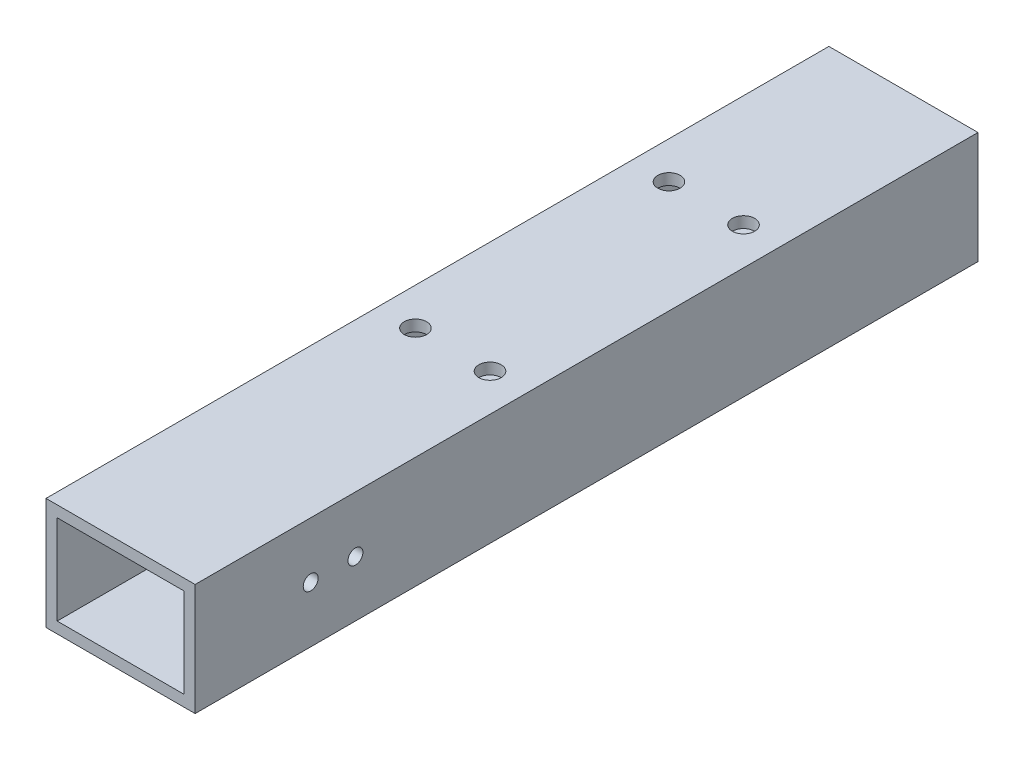
ISO-10303-21;
HEADER;
FILE_DESCRIPTION(('STEP AP214'),'2;1');
FILE_NAME('part.step','',(''),(''),'','','');
FILE_SCHEMA(('AUTOMOTIVE_DESIGN { 1 0 10303 214 1 1 1 1 }'));
ENDSEC;
DATA;
#1=APPLICATION_CONTEXT('core data for automotive mechanical design processes');
#2=APPLICATION_PROTOCOL_DEFINITION('international standard','automotive_design',2000,#1);
#3=PRODUCT_CONTEXT('',#1,'mechanical');
#4=PRODUCT('Part','Part','',(#3));
#5=PRODUCT_RELATED_PRODUCT_CATEGORY('part','',(#4));
#6=PRODUCT_DEFINITION_FORMATION('','',#4);
#7=PRODUCT_DEFINITION_CONTEXT('part definition',#1,'design');
#8=PRODUCT_DEFINITION('design','',#6,#7);
#9=PRODUCT_DEFINITION_SHAPE('','',#8);
#10=(LENGTH_UNIT() NAMED_UNIT(*) SI_UNIT(.MILLI.,.METRE.));
#11=(NAMED_UNIT(*) PLANE_ANGLE_UNIT() SI_UNIT($,.RADIAN.));
#12=(NAMED_UNIT(*) SI_UNIT($,.STERADIAN.) SOLID_ANGLE_UNIT());
#13=UNCERTAINTY_MEASURE_WITH_UNIT(LENGTH_MEASURE(1.E-05),#10,'distance_accuracy_value','');
#14=(GEOMETRIC_REPRESENTATION_CONTEXT(3) GLOBAL_UNCERTAINTY_ASSIGNED_CONTEXT((#13)) GLOBAL_UNIT_ASSIGNED_CONTEXT((#10,
#11,#12)) REPRESENTATION_CONTEXT('',''));
#15=CARTESIAN_POINT('',(0.,0.,0.));
#16=DIRECTION('',(0.,0.,1.));
#17=DIRECTION('',(1.,0.,0.));
#18=AXIS2_PLACEMENT_3D('',#15,#16,#17);
#19=CARTESIAN_POINT('',(0.,0.,210.));
#20=DIRECTION('',(0.,0.,-1.));
#21=DIRECTION('',(-1.,0.,0.));
#22=AXIS2_PLACEMENT_3D('',#19,#20,#21);
#23=PLANE('',#22);
#24=DIRECTION('',(0.,-1.,0.));
#25=VECTOR('',#24,1.);
#26=CARTESIAN_POINT('',(0.,0.,210.));
#27=LINE('',#26,#25);
#28=CARTESIAN_POINT('',(0.,30.,210.));
#29=VERTEX_POINT('',#28);
#30=CARTESIAN_POINT('',(0.,0.,210.));
#31=VERTEX_POINT('',#30);
#32=EDGE_CURVE('E139',#29,#31,#27,.T.);
#33=ORIENTED_EDGE('',*,*,#32,.T.);
#34=DIRECTION('',(1.,0.,0.));
#35=VECTOR('',#34,1.);
#36=CARTESIAN_POINT('',(0.,0.,210.));
#37=LINE('',#36,#35);
#38=CARTESIAN_POINT('',(40.,0.,210.));
#39=VERTEX_POINT('',#38);
#40=EDGE_CURVE('E142',#31,#39,#37,.T.);
#41=ORIENTED_EDGE('',*,*,#40,.T.);
#42=DIRECTION('',(0.,1.,0.));
#43=VECTOR('',#42,1.);
#44=CARTESIAN_POINT('',(40.,0.,210.));
#45=LINE('',#44,#43);
#46=CARTESIAN_POINT('',(40.,30.,210.));
#47=VERTEX_POINT('',#46);
#48=EDGE_CURVE('E145',#39,#47,#45,.T.);
#49=ORIENTED_EDGE('',*,*,#48,.T.);
#50=DIRECTION('',(-1.,0.,0.));
#51=VECTOR('',#50,1.);
#52=CARTESIAN_POINT('',(0.,30.,210.));
#53=LINE('',#52,#51);
#54=EDGE_CURVE('E147',#47,#29,#53,.T.);
#55=ORIENTED_EDGE('',*,*,#54,.T.);
#56=EDGE_LOOP('',(#33,#41,#49,#55));
#57=FACE_BOUND('',#56,.T.);
#58=DIRECTION('',(0.,-1.,0.));
#59=VECTOR('',#58,1.);
#60=CARTESIAN_POINT('',(3.,3.,210.));
#61=LINE('',#60,#59);
#62=CARTESIAN_POINT('',(3.,27.,210.));
#63=VERTEX_POINT('',#62);
#64=CARTESIAN_POINT('',(3.,3.,210.));
#65=VERTEX_POINT('',#64);
#66=EDGE_CURVE('E101',#63,#65,#61,.T.);
#67=ORIENTED_EDGE('',*,*,#66,.F.);
#68=DIRECTION('',(-1.,0.,0.));
#69=VECTOR('',#68,1.);
#70=CARTESIAN_POINT('',(3.,27.,210.));
#71=LINE('',#70,#69);
#72=CARTESIAN_POINT('',(37.,27.,210.));
#73=VERTEX_POINT('',#72);
#74=EDGE_CURVE('E123',#73,#63,#71,.T.);
#75=ORIENTED_EDGE('',*,*,#74,.F.);
#76=DIRECTION('',(0.,1.,0.));
#77=VECTOR('',#76,1.);
#78=CARTESIAN_POINT('',(37.,3.,210.));
#79=LINE('',#78,#77);
#80=CARTESIAN_POINT('',(37.,3.,210.));
#81=VERTEX_POINT('',#80);
#82=EDGE_CURVE('E121',#81,#73,#79,.T.);
#83=ORIENTED_EDGE('',*,*,#82,.F.);
#84=DIRECTION('',(1.,0.,0.));
#85=VECTOR('',#84,1.);
#86=CARTESIAN_POINT('',(3.,3.,210.));
#87=LINE('',#86,#85);
#88=EDGE_CURVE('E109',#65,#81,#87,.T.);
#89=ORIENTED_EDGE('',*,*,#88,.F.);
#90=EDGE_LOOP('',(#67,#75,#83,#89));
#91=FACE_BOUND('',#90,.T.);
#92=ADVANCED_FACE('F34',(#57,#91),#23,.F.);
#93=CARTESIAN_POINT('',(0.,0.,0.));
#94=DIRECTION('',(0.,0.,-1.));
#95=DIRECTION('',(-1.,0.,0.));
#96=AXIS2_PLACEMENT_3D('',#93,#94,#95);
#97=PLANE('',#96);
#98=DIRECTION('',(0.,-1.,0.));
#99=VECTOR('',#98,1.);
#100=CARTESIAN_POINT('',(0.,0.,0.));
#101=LINE('',#100,#99);
#102=CARTESIAN_POINT('',(0.,30.,0.));
#103=VERTEX_POINT('',#102);
#104=CARTESIAN_POINT('',(0.,0.,0.));
#105=VERTEX_POINT('',#104);
#106=EDGE_CURVE('E117',#103,#105,#101,.T.);
#107=ORIENTED_EDGE('',*,*,#106,.F.);
#108=DIRECTION('',(-1.,0.,0.));
#109=VECTOR('',#108,1.);
#110=CARTESIAN_POINT('',(0.,30.,0.));
#111=LINE('',#110,#109);
#112=CARTESIAN_POINT('',(40.,30.,0.));
#113=VERTEX_POINT('',#112);
#114=EDGE_CURVE('E143',#113,#103,#111,.T.);
#115=ORIENTED_EDGE('',*,*,#114,.F.);
#116=DIRECTION('',(0.,1.,0.));
#117=VECTOR('',#116,1.);
#118=CARTESIAN_POINT('',(40.,0.,0.));
#119=LINE('',#118,#117);
#120=CARTESIAN_POINT('',(40.,0.,0.));
#121=VERTEX_POINT('',#120);
#122=EDGE_CURVE('E154',#121,#113,#119,.T.);
#123=ORIENTED_EDGE('',*,*,#122,.F.);
#124=DIRECTION('',(1.,0.,0.));
#125=VECTOR('',#124,1.);
#126=CARTESIAN_POINT('',(0.,0.,0.));
#127=LINE('',#126,#125);
#128=EDGE_CURVE('E152',#105,#121,#127,.T.);
#129=ORIENTED_EDGE('',*,*,#128,.F.);
#130=EDGE_LOOP('',(#107,#115,#123,#129));
#131=FACE_BOUND('',#130,.T.);
#132=DIRECTION('',(-1.,0.,0.));
#133=VECTOR('',#132,1.);
#134=CARTESIAN_POINT('',(3.,27.,0.));
#135=LINE('',#134,#133);
#136=CARTESIAN_POINT('',(37.,27.,0.));
#137=VERTEX_POINT('',#136);
#138=CARTESIAN_POINT('',(3.,27.,0.));
#139=VERTEX_POINT('',#138);
#140=EDGE_CURVE('E110',#137,#139,#135,.T.);
#141=ORIENTED_EDGE('',*,*,#140,.T.);
#142=DIRECTION('',(0.,-1.,0.));
#143=VECTOR('',#142,1.);
#144=CARTESIAN_POINT('',(3.,3.,0.));
#145=LINE('',#144,#143);
#146=CARTESIAN_POINT('',(3.,3.,0.));
#147=VERTEX_POINT('',#146);
#148=EDGE_CURVE('E59',#139,#147,#145,.T.);
#149=ORIENTED_EDGE('',*,*,#148,.T.);
#150=DIRECTION('',(1.,0.,0.));
#151=VECTOR('',#150,1.);
#152=CARTESIAN_POINT('',(3.,3.,0.));
#153=LINE('',#152,#151);
#154=CARTESIAN_POINT('',(37.,3.,0.));
#155=VERTEX_POINT('',#154);
#156=EDGE_CURVE('E116',#147,#155,#153,.T.);
#157=ORIENTED_EDGE('',*,*,#156,.T.);
#158=DIRECTION('',(0.,1.,0.));
#159=VECTOR('',#158,1.);
#160=CARTESIAN_POINT('',(37.,3.,0.));
#161=LINE('',#160,#159);
#162=EDGE_CURVE('E131',#155,#137,#161,.T.);
#163=ORIENTED_EDGE('',*,*,#162,.T.);
#164=EDGE_LOOP('',(#141,#149,#157,#163));
#165=FACE_BOUND('',#164,.T.);
#166=ADVANCED_FACE('F226',(#131,#165),#97,.T.);
#167=CARTESIAN_POINT('',(0.,0.,210.));
#168=DIRECTION('',(1.,0.,0.));
#169=DIRECTION('',(0.,0.,-1.));
#170=AXIS2_PLACEMENT_3D('',#167,#168,#169);
#171=PLANE('',#170);
#172=CARTESIAN_POINT('',(0.,15.,167.));
#173=DIRECTION('',(1.,0.,0.));
#174=DIRECTION('',(0.,0.,-1.));
#175=AXIS2_PLACEMENT_3D('',#172,#173,#174);
#176=CIRCLE('',#175,2.);
#177=CARTESIAN_POINT('',(0.,15.,165.));
#178=VERTEX_POINT('',#177);
#179=EDGE_CURVE('E200',#178,#178,#176,.T.);
#180=ORIENTED_EDGE('',*,*,#179,.T.);
#181=EDGE_LOOP('',(#180));
#182=FACE_BOUND('',#181,.T.);
#183=CARTESIAN_POINT('',(0.,15.,179.));
#184=DIRECTION('',(1.,0.,0.));
#185=DIRECTION('',(0.,0.,-1.));
#186=AXIS2_PLACEMENT_3D('',#183,#184,#185);
#187=CIRCLE('',#186,2.);
#188=CARTESIAN_POINT('',(0.,15.,177.));
#189=VERTEX_POINT('',#188);
#190=EDGE_CURVE('E197',#189,#189,#187,.T.);
#191=ORIENTED_EDGE('',*,*,#190,.T.);
#192=EDGE_LOOP('',(#191));
#193=FACE_BOUND('',#192,.T.);
#194=ORIENTED_EDGE('',*,*,#106,.T.);
#195=DIRECTION('',(0.,0.,-1.));
#196=VECTOR('',#195,1.);
#197=CARTESIAN_POINT('',(0.,0.,210.));
#198=LINE('',#197,#196);
#199=EDGE_CURVE('E11',#31,#105,#198,.T.);
#200=ORIENTED_EDGE('',*,*,#199,.F.);
#201=ORIENTED_EDGE('',*,*,#32,.F.);
#202=DIRECTION('',(0.,0.,-1.));
#203=VECTOR('',#202,1.);
#204=CARTESIAN_POINT('',(0.,30.,210.));
#205=LINE('',#204,#203);
#206=EDGE_CURVE('E149',#29,#103,#205,.T.);
#207=ORIENTED_EDGE('',*,*,#206,.T.);
#208=EDGE_LOOP('',(#194,#200,#201,#207));
#209=FACE_BOUND('',#208,.T.);
#210=ADVANCED_FACE('F36',(#182,#193,#209),#171,.F.);
#211=CARTESIAN_POINT('',(0.,0.,210.));
#212=DIRECTION('',(0.,1.,0.));
#213=DIRECTION('',(0.,0.,1.));
#214=AXIS2_PLACEMENT_3D('',#211,#212,#213);
#215=PLANE('',#214);
#216=CARTESIAN_POINT('',(10.,0.,120.9));
#217=DIRECTION('',(0.,1.,0.));
#218=DIRECTION('',(0.,0.,-1.));
#219=AXIS2_PLACEMENT_3D('',#216,#217,#218);
#220=CIRCLE('',#219,3.);
#221=CARTESIAN_POINT('',(10.,0.,117.9));
#222=VERTEX_POINT('',#221);
#223=EDGE_CURVE('E335',#222,#222,#220,.T.);
#224=ORIENTED_EDGE('',*,*,#223,.T.);
#225=EDGE_LOOP('',(#224));
#226=FACE_BOUND('',#225,.T.);
#227=CARTESIAN_POINT('',(30.,0.,120.9));
#228=DIRECTION('',(0.,1.,0.));
#229=DIRECTION('',(0.,0.,1.));
#230=AXIS2_PLACEMENT_3D('',#227,#228,#229);
#231=CIRCLE('',#230,2.99999999999999);
#232=CARTESIAN_POINT('',(30.,0.,123.9));
#233=VERTEX_POINT('',#232);
#234=EDGE_CURVE('E327',#233,#233,#231,.T.);
#235=ORIENTED_EDGE('',*,*,#234,.T.);
#236=EDGE_LOOP('',(#235));
#237=FACE_BOUND('',#236,.T.);
#238=CARTESIAN_POINT('',(30.,0.,52.9));
#239=DIRECTION('',(0.,1.,0.));
#240=DIRECTION('',(0.,0.,-1.));
#241=AXIS2_PLACEMENT_3D('',#238,#239,#240);
#242=CIRCLE('',#241,2.99999999999999);
#243=CARTESIAN_POINT('',(30.,0.,49.9));
#244=VERTEX_POINT('',#243);
#245=EDGE_CURVE('E318',#244,#244,#242,.T.);
#246=ORIENTED_EDGE('',*,*,#245,.T.);
#247=EDGE_LOOP('',(#246));
#248=FACE_BOUND('',#247,.T.);
#249=CARTESIAN_POINT('',(10.,0.,52.9));
#250=DIRECTION('',(0.,1.,0.));
#251=DIRECTION('',(0.,0.,1.));
#252=AXIS2_PLACEMENT_3D('',#249,#250,#251);
#253=CIRCLE('',#252,3.);
#254=CARTESIAN_POINT('',(10.,0.,55.9));
#255=VERTEX_POINT('',#254);
#256=EDGE_CURVE('E324',#255,#255,#253,.T.);
#257=ORIENTED_EDGE('',*,*,#256,.T.);
#258=EDGE_LOOP('',(#257));
#259=FACE_BOUND('',#258,.T.);
#260=ORIENTED_EDGE('',*,*,#128,.T.);
#261=DIRECTION('',(0.,0.,-1.));
#262=VECTOR('',#261,1.);
#263=CARTESIAN_POINT('',(40.,0.,210.));
#264=LINE('',#263,#262);
#265=EDGE_CURVE('E43',#39,#121,#264,.T.);
#266=ORIENTED_EDGE('',*,*,#265,.F.);
#267=ORIENTED_EDGE('',*,*,#40,.F.);
#268=ORIENTED_EDGE('',*,*,#199,.T.);
#269=EDGE_LOOP('',(#260,#266,#267,#268));
#270=FACE_BOUND('',#269,.T.);
#271=ADVANCED_FACE('F225',(#226,#237,#248,#259,#270),#215,.F.);
#272=CARTESIAN_POINT('',(40.,0.,210.));
#273=DIRECTION('',(-1.,0.,0.));
#274=DIRECTION('',(0.,0.,1.));
#275=AXIS2_PLACEMENT_3D('',#272,#273,#274);
#276=PLANE('',#275);
#277=CARTESIAN_POINT('',(40.,15.,167.));
#278=DIRECTION('',(1.,0.,0.));
#279=DIRECTION('',(0.,0.,-1.));
#280=AXIS2_PLACEMENT_3D('',#277,#278,#279);
#281=CIRCLE('',#280,2.);
#282=CARTESIAN_POINT('',(40.,15.,165.));
#283=VERTEX_POINT('',#282);
#284=EDGE_CURVE('E168',#283,#283,#281,.T.);
#285=ORIENTED_EDGE('',*,*,#284,.F.);
#286=EDGE_LOOP('',(#285));
#287=FACE_BOUND('',#286,.T.);
#288=CARTESIAN_POINT('',(40.,15.,179.));
#289=DIRECTION('',(1.,0.,0.));
#290=DIRECTION('',(0.,0.,-1.));
#291=AXIS2_PLACEMENT_3D('',#288,#289,#290);
#292=CIRCLE('',#291,2.);
#293=CARTESIAN_POINT('',(40.,15.,177.));
#294=VERTEX_POINT('',#293);
#295=EDGE_CURVE('E203',#294,#294,#292,.T.);
#296=ORIENTED_EDGE('',*,*,#295,.F.);
#297=EDGE_LOOP('',(#296));
#298=FACE_BOUND('',#297,.T.);
#299=ORIENTED_EDGE('',*,*,#122,.T.);
#300=DIRECTION('',(0.,0.,-1.));
#301=VECTOR('',#300,1.);
#302=CARTESIAN_POINT('',(40.,30.,210.));
#303=LINE('',#302,#301);
#304=EDGE_CURVE('E159',#47,#113,#303,.T.);
#305=ORIENTED_EDGE('',*,*,#304,.F.);
#306=ORIENTED_EDGE('',*,*,#48,.F.);
#307=ORIENTED_EDGE('',*,*,#265,.T.);
#308=EDGE_LOOP('',(#299,#305,#306,#307));
#309=FACE_BOUND('',#308,.T.);
#310=ADVANCED_FACE('F246',(#287,#298,#309),#276,.F.);
#311=CARTESIAN_POINT('',(0.,30.,210.));
#312=DIRECTION('',(0.,-1.,0.));
#313=DIRECTION('',(0.,0.,-1.));
#314=AXIS2_PLACEMENT_3D('',#311,#312,#313);
#315=PLANE('',#314);
#316=CARTESIAN_POINT('',(10.,30.,120.9));
#317=DIRECTION('',(0.,1.,0.));
#318=DIRECTION('',(0.,0.,-1.));
#319=AXIS2_PLACEMENT_3D('',#316,#317,#318);
#320=CIRCLE('',#319,3.);
#321=CARTESIAN_POINT('',(10.,30.,117.9));
#322=VERTEX_POINT('',#321);
#323=EDGE_CURVE('E332',#322,#322,#320,.T.);
#324=ORIENTED_EDGE('',*,*,#323,.F.);
#325=EDGE_LOOP('',(#324));
#326=FACE_BOUND('',#325,.T.);
#327=CARTESIAN_POINT('',(30.,30.,120.9));
#328=DIRECTION('',(0.,1.,0.));
#329=DIRECTION('',(0.,0.,1.));
#330=AXIS2_PLACEMENT_3D('',#327,#328,#329);
#331=CIRCLE('',#330,2.99999999999999);
#332=CARTESIAN_POINT('',(30.,30.,123.9));
#333=VERTEX_POINT('',#332);
#334=EDGE_CURVE('E321',#333,#333,#331,.T.);
#335=ORIENTED_EDGE('',*,*,#334,.F.);
#336=EDGE_LOOP('',(#335));
#337=FACE_BOUND('',#336,.T.);
#338=CARTESIAN_POINT('',(30.,30.,52.9));
#339=DIRECTION('',(0.,1.,0.));
#340=DIRECTION('',(0.,0.,-1.));
#341=AXIS2_PLACEMENT_3D('',#338,#339,#340);
#342=CIRCLE('',#341,2.99999999999999);
#343=CARTESIAN_POINT('',(30.,30.,49.9));
#344=VERTEX_POINT('',#343);
#345=EDGE_CURVE('E320',#344,#344,#342,.T.);
#346=ORIENTED_EDGE('',*,*,#345,.F.);
#347=EDGE_LOOP('',(#346));
#348=FACE_BOUND('',#347,.T.);
#349=CARTESIAN_POINT('',(10.,30.,52.9));
#350=DIRECTION('',(0.,1.,0.));
#351=DIRECTION('',(0.,0.,1.));
#352=AXIS2_PLACEMENT_3D('',#349,#350,#351);
#353=CIRCLE('',#352,3.);
#354=CARTESIAN_POINT('',(10.,30.,55.9));
#355=VERTEX_POINT('',#354);
#356=EDGE_CURVE('E176',#355,#355,#353,.T.);
#357=ORIENTED_EDGE('',*,*,#356,.F.);
#358=EDGE_LOOP('',(#357));
#359=FACE_BOUND('',#358,.T.);
#360=ORIENTED_EDGE('',*,*,#114,.T.);
#361=ORIENTED_EDGE('',*,*,#206,.F.);
#362=ORIENTED_EDGE('',*,*,#54,.F.);
#363=ORIENTED_EDGE('',*,*,#304,.T.);
#364=EDGE_LOOP('',(#360,#361,#362,#363));
#365=FACE_BOUND('',#364,.T.);
#366=ADVANCED_FACE('F244',(#326,#337,#348,#359,#365),#315,.F.);
#367=CARTESIAN_POINT('',(3.,3.,210.));
#368=DIRECTION('',(1.,0.,0.));
#369=DIRECTION('',(0.,0.,-1.));
#370=AXIS2_PLACEMENT_3D('',#367,#368,#369);
#371=PLANE('',#370);
#372=CARTESIAN_POINT('',(3.,15.,167.));
#373=DIRECTION('',(1.,0.,0.));
#374=DIRECTION('',(0.,0.,-1.));
#375=AXIS2_PLACEMENT_3D('',#372,#373,#374);
#376=CIRCLE('',#375,2.);
#377=CARTESIAN_POINT('',(3.,15.,165.));
#378=VERTEX_POINT('',#377);
#379=EDGE_CURVE('E129',#378,#378,#376,.F.);
#380=ORIENTED_EDGE('',*,*,#379,.T.);
#381=EDGE_LOOP('',(#380));
#382=FACE_BOUND('',#381,.T.);
#383=CARTESIAN_POINT('',(3.,15.,179.));
#384=DIRECTION('',(1.,0.,0.));
#385=DIRECTION('',(0.,0.,-1.));
#386=AXIS2_PLACEMENT_3D('',#383,#384,#385);
#387=CIRCLE('',#386,2.);
#388=CARTESIAN_POINT('',(3.,15.,177.));
#389=VERTEX_POINT('',#388);
#390=EDGE_CURVE('E167',#389,#389,#387,.F.);
#391=ORIENTED_EDGE('',*,*,#390,.T.);
#392=EDGE_LOOP('',(#391));
#393=FACE_BOUND('',#392,.T.);
#394=ORIENTED_EDGE('',*,*,#148,.F.);
#395=DIRECTION('',(0.,0.,-1.));
#396=VECTOR('',#395,1.);
#397=CARTESIAN_POINT('',(3.,27.,210.));
#398=LINE('',#397,#396);
#399=EDGE_CURVE('E105',#63,#139,#398,.T.);
#400=ORIENTED_EDGE('',*,*,#399,.F.);
#401=ORIENTED_EDGE('',*,*,#66,.T.);
#402=DIRECTION('',(0.,0.,-1.));
#403=VECTOR('',#402,1.);
#404=CARTESIAN_POINT('',(3.,3.,210.));
#405=LINE('',#404,#403);
#406=EDGE_CURVE('E104',#65,#147,#405,.T.);
#407=ORIENTED_EDGE('',*,*,#406,.T.);
#408=EDGE_LOOP('',(#394,#400,#401,#407));
#409=FACE_BOUND('',#408,.T.);
#410=ADVANCED_FACE('F103',(#382,#393,#409),#371,.T.);
#411=CARTESIAN_POINT('',(3.,3.,210.));
#412=DIRECTION('',(0.,1.,0.));
#413=DIRECTION('',(0.,0.,1.));
#414=AXIS2_PLACEMENT_3D('',#411,#412,#413);
#415=PLANE('',#414);
#416=CARTESIAN_POINT('',(10.,3.,120.9));
#417=DIRECTION('',(0.,1.,0.));
#418=DIRECTION('',(0.,0.,1.));
#419=AXIS2_PLACEMENT_3D('',#416,#417,#418);
#420=CIRCLE('',#419,3.);
#421=CARTESIAN_POINT('',(10.,3.,123.9));
#422=VERTEX_POINT('',#421);
#423=EDGE_CURVE('E194',#422,#422,#420,.F.);
#424=ORIENTED_EDGE('',*,*,#423,.T.);
#425=EDGE_LOOP('',(#424));
#426=FACE_BOUND('',#425,.T.);
#427=CARTESIAN_POINT('',(30.,3.,120.9));
#428=DIRECTION('',(0.,1.,0.));
#429=DIRECTION('',(0.,0.,1.));
#430=AXIS2_PLACEMENT_3D('',#427,#428,#429);
#431=CIRCLE('',#430,2.99999999999999);
#432=CARTESIAN_POINT('',(30.,3.,123.9));
#433=VERTEX_POINT('',#432);
#434=EDGE_CURVE('E182',#433,#433,#431,.F.);
#435=ORIENTED_EDGE('',*,*,#434,.T.);
#436=EDGE_LOOP('',(#435));
#437=FACE_BOUND('',#436,.T.);
#438=CARTESIAN_POINT('',(30.,3.,52.9));
#439=DIRECTION('',(0.,1.,0.));
#440=DIRECTION('',(0.,0.,1.));
#441=AXIS2_PLACEMENT_3D('',#438,#439,#440);
#442=CIRCLE('',#441,2.99999999999999);
#443=CARTESIAN_POINT('',(30.,3.,55.9));
#444=VERTEX_POINT('',#443);
#445=EDGE_CURVE('E179',#444,#444,#442,.F.);
#446=ORIENTED_EDGE('',*,*,#445,.T.);
#447=EDGE_LOOP('',(#446));
#448=FACE_BOUND('',#447,.T.);
#449=CARTESIAN_POINT('',(10.,3.,52.9));
#450=DIRECTION('',(0.,1.,0.));
#451=DIRECTION('',(0.,0.,1.));
#452=AXIS2_PLACEMENT_3D('',#449,#450,#451);
#453=CIRCLE('',#452,3.);
#454=CARTESIAN_POINT('',(10.,3.,55.9));
#455=VERTEX_POINT('',#454);
#456=EDGE_CURVE('E175',#455,#455,#453,.F.);
#457=ORIENTED_EDGE('',*,*,#456,.T.);
#458=EDGE_LOOP('',(#457));
#459=FACE_BOUND('',#458,.T.);
#460=ORIENTED_EDGE('',*,*,#156,.F.);
#461=ORIENTED_EDGE('',*,*,#406,.F.);
#462=ORIENTED_EDGE('',*,*,#88,.T.);
#463=DIRECTION('',(0.,0.,-1.));
#464=VECTOR('',#463,1.);
#465=CARTESIAN_POINT('',(37.,3.,210.));
#466=LINE('',#465,#464);
#467=EDGE_CURVE('E118',#81,#155,#466,.T.);
#468=ORIENTED_EDGE('',*,*,#467,.T.);
#469=EDGE_LOOP('',(#460,#461,#462,#468));
#470=FACE_BOUND('',#469,.T.);
#471=ADVANCED_FACE('F113',(#426,#437,#448,#459,#470),#415,.T.);
#472=CARTESIAN_POINT('',(37.,3.,210.));
#473=DIRECTION('',(-1.,0.,0.));
#474=DIRECTION('',(0.,0.,1.));
#475=AXIS2_PLACEMENT_3D('',#472,#473,#474);
#476=PLANE('',#475);
#477=CARTESIAN_POINT('',(37.,15.,167.));
#478=DIRECTION('',(-1.,0.,0.));
#479=DIRECTION('',(0.,0.,1.));
#480=AXIS2_PLACEMENT_3D('',#477,#478,#479);
#481=CIRCLE('',#480,2.);
#482=CARTESIAN_POINT('',(37.,15.,169.));
#483=VERTEX_POINT('',#482);
#484=EDGE_CURVE('E169',#483,#483,#481,.F.);
#485=ORIENTED_EDGE('',*,*,#484,.T.);
#486=EDGE_LOOP('',(#485));
#487=FACE_BOUND('',#486,.T.);
#488=CARTESIAN_POINT('',(37.,15.,179.));
#489=DIRECTION('',(-1.,0.,0.));
#490=DIRECTION('',(0.,0.,1.));
#491=AXIS2_PLACEMENT_3D('',#488,#489,#490);
#492=CIRCLE('',#491,2.);
#493=CARTESIAN_POINT('',(37.,15.,181.));
#494=VERTEX_POINT('',#493);
#495=EDGE_CURVE('E164',#494,#494,#492,.F.);
#496=ORIENTED_EDGE('',*,*,#495,.T.);
#497=EDGE_LOOP('',(#496));
#498=FACE_BOUND('',#497,.T.);
#499=ORIENTED_EDGE('',*,*,#162,.F.);
#500=ORIENTED_EDGE('',*,*,#467,.F.);
#501=ORIENTED_EDGE('',*,*,#82,.T.);
#502=DIRECTION('',(0.,0.,-1.));
#503=VECTOR('',#502,1.);
#504=CARTESIAN_POINT('',(37.,27.,210.));
#505=LINE('',#504,#503);
#506=EDGE_CURVE('E51',#73,#137,#505,.T.);
#507=ORIENTED_EDGE('',*,*,#506,.T.);
#508=EDGE_LOOP('',(#499,#500,#501,#507));
#509=FACE_BOUND('',#508,.T.);
#510=ADVANCED_FACE('F270',(#487,#498,#509),#476,.T.);
#511=CARTESIAN_POINT('',(3.,27.,210.));
#512=DIRECTION('',(0.,-1.,0.));
#513=DIRECTION('',(0.,0.,-1.));
#514=AXIS2_PLACEMENT_3D('',#511,#512,#513);
#515=PLANE('',#514);
#516=CARTESIAN_POINT('',(10.,27.,120.9));
#517=DIRECTION('',(0.,-1.,0.));
#518=DIRECTION('',(0.,0.,-1.));
#519=AXIS2_PLACEMENT_3D('',#516,#517,#518);
#520=CIRCLE('',#519,3.);
#521=CARTESIAN_POINT('',(10.,27.,117.9));
#522=VERTEX_POINT('',#521);
#523=EDGE_CURVE('E38',#522,#522,#520,.F.);
#524=ORIENTED_EDGE('',*,*,#523,.T.);
#525=EDGE_LOOP('',(#524));
#526=FACE_BOUND('',#525,.T.);
#527=CARTESIAN_POINT('',(30.,27.,120.9));
#528=DIRECTION('',(0.,-1.,0.));
#529=DIRECTION('',(0.,0.,-1.));
#530=AXIS2_PLACEMENT_3D('',#527,#528,#529);
#531=CIRCLE('',#530,2.99999999999999);
#532=CARTESIAN_POINT('',(30.,27.,117.9));
#533=VERTEX_POINT('',#532);
#534=EDGE_CURVE('E180',#533,#533,#531,.F.);
#535=ORIENTED_EDGE('',*,*,#534,.T.);
#536=EDGE_LOOP('',(#535));
#537=FACE_BOUND('',#536,.T.);
#538=CARTESIAN_POINT('',(30.,27.,52.9));
#539=DIRECTION('',(0.,-1.,0.));
#540=DIRECTION('',(0.,0.,-1.));
#541=AXIS2_PLACEMENT_3D('',#538,#539,#540);
#542=CIRCLE('',#541,2.99999999999999);
#543=CARTESIAN_POINT('',(30.,27.,49.9));
#544=VERTEX_POINT('',#543);
#545=EDGE_CURVE('E177',#544,#544,#542,.F.);
#546=ORIENTED_EDGE('',*,*,#545,.T.);
#547=EDGE_LOOP('',(#546));
#548=FACE_BOUND('',#547,.T.);
#549=CARTESIAN_POINT('',(10.,27.,52.9));
#550=DIRECTION('',(0.,-1.,0.));
#551=DIRECTION('',(0.,0.,-1.));
#552=AXIS2_PLACEMENT_3D('',#549,#550,#551);
#553=CIRCLE('',#552,3.);
#554=CARTESIAN_POINT('',(10.,27.,49.9));
#555=VERTEX_POINT('',#554);
#556=EDGE_CURVE('E172',#555,#555,#553,.F.);
#557=ORIENTED_EDGE('',*,*,#556,.T.);
#558=EDGE_LOOP('',(#557));
#559=FACE_BOUND('',#558,.T.);
#560=ORIENTED_EDGE('',*,*,#140,.F.);
#561=ORIENTED_EDGE('',*,*,#506,.F.);
#562=ORIENTED_EDGE('',*,*,#74,.T.);
#563=ORIENTED_EDGE('',*,*,#399,.T.);
#564=EDGE_LOOP('',(#560,#561,#562,#563));
#565=FACE_BOUND('',#564,.T.);
#566=ADVANCED_FACE('F274',(#526,#537,#548,#559,#565),#515,.T.);
#567=CARTESIAN_POINT('',(40.,15.,179.));
#568=DIRECTION('',(-1.,0.,0.));
#569=DIRECTION('',(0.,0.,1.));
#570=AXIS2_PLACEMENT_3D('',#567,#568,#569);
#571=CYLINDRICAL_SURFACE('',#570,2.);
#572=ORIENTED_EDGE('',*,*,#495,.F.);
#573=EDGE_LOOP('',(#572));
#574=FACE_BOUND('',#573,.T.);
#575=ORIENTED_EDGE('',*,*,#295,.T.);
#576=EDGE_LOOP('',(#575));
#577=FACE_BOUND('',#576,.T.);
#578=ADVANCED_FACE('F278',(#574,#577),#571,.F.);
#579=CARTESIAN_POINT('',(40.,15.,167.));
#580=DIRECTION('',(-1.,0.,0.));
#581=DIRECTION('',(0.,0.,1.));
#582=AXIS2_PLACEMENT_3D('',#579,#580,#581);
#583=CYLINDRICAL_SURFACE('',#582,2.);
#584=ORIENTED_EDGE('',*,*,#484,.F.);
#585=EDGE_LOOP('',(#584));
#586=FACE_BOUND('',#585,.T.);
#587=ORIENTED_EDGE('',*,*,#284,.T.);
#588=EDGE_LOOP('',(#587));
#589=FACE_BOUND('',#588,.T.);
#590=ADVANCED_FACE('F220',(#586,#589),#583,.F.);
#591=ORIENTED_EDGE('',*,*,#390,.F.);
#592=EDGE_LOOP('',(#591));
#593=FACE_BOUND('',#592,.T.);
#594=ORIENTED_EDGE('',*,*,#190,.F.);
#595=EDGE_LOOP('',(#594));
#596=FACE_BOUND('',#595,.T.);
#597=ADVANCED_FACE('F218',(#593,#596),#571,.F.);
#598=ORIENTED_EDGE('',*,*,#379,.F.);
#599=EDGE_LOOP('',(#598));
#600=FACE_BOUND('',#599,.T.);
#601=ORIENTED_EDGE('',*,*,#179,.F.);
#602=EDGE_LOOP('',(#601));
#603=FACE_BOUND('',#602,.T.);
#604=ADVANCED_FACE('F214',(#600,#603),#583,.F.);
#605=CARTESIAN_POINT('',(10.,30.,52.9));
#606=DIRECTION('',(0.,-1.,0.));
#607=DIRECTION('',(0.,0.,-1.));
#608=AXIS2_PLACEMENT_3D('',#605,#606,#607);
#609=CYLINDRICAL_SURFACE('',#608,3.);
#610=ORIENTED_EDGE('',*,*,#556,.F.);
#611=EDGE_LOOP('',(#610));
#612=FACE_BOUND('',#611,.T.);
#613=ORIENTED_EDGE('',*,*,#356,.T.);
#614=EDGE_LOOP('',(#613));
#615=FACE_BOUND('',#614,.T.);
#616=ADVANCED_FACE('F217',(#612,#615),#609,.F.);
#617=CARTESIAN_POINT('',(30.,30.,52.9));
#618=DIRECTION('',(0.,-1.,0.));
#619=DIRECTION('',(0.,0.,-1.));
#620=AXIS2_PLACEMENT_3D('',#617,#618,#619);
#621=CYLINDRICAL_SURFACE('',#620,2.99999999999999);
#622=ORIENTED_EDGE('',*,*,#545,.F.);
#623=EDGE_LOOP('',(#622));
#624=FACE_BOUND('',#623,.T.);
#625=ORIENTED_EDGE('',*,*,#345,.T.);
#626=EDGE_LOOP('',(#625));
#627=FACE_BOUND('',#626,.T.);
#628=ADVANCED_FACE('F287',(#624,#627),#621,.F.);
#629=CARTESIAN_POINT('',(30.,30.,120.9));
#630=DIRECTION('',(0.,-1.,0.));
#631=DIRECTION('',(0.,0.,-1.));
#632=AXIS2_PLACEMENT_3D('',#629,#630,#631);
#633=CYLINDRICAL_SURFACE('',#632,2.99999999999999);
#634=ORIENTED_EDGE('',*,*,#534,.F.);
#635=EDGE_LOOP('',(#634));
#636=FACE_BOUND('',#635,.T.);
#637=ORIENTED_EDGE('',*,*,#334,.T.);
#638=EDGE_LOOP('',(#637));
#639=FACE_BOUND('',#638,.T.);
#640=ADVANCED_FACE('F293',(#636,#639),#633,.F.);
#641=CARTESIAN_POINT('',(10.,30.,120.9));
#642=DIRECTION('',(0.,-1.,0.));
#643=DIRECTION('',(0.,0.,-1.));
#644=AXIS2_PLACEMENT_3D('',#641,#642,#643);
#645=CYLINDRICAL_SURFACE('',#644,3.);
#646=ORIENTED_EDGE('',*,*,#523,.F.);
#647=EDGE_LOOP('',(#646));
#648=FACE_BOUND('',#647,.T.);
#649=ORIENTED_EDGE('',*,*,#323,.T.);
#650=EDGE_LOOP('',(#649));
#651=FACE_BOUND('',#650,.T.);
#652=ADVANCED_FACE('F290',(#648,#651),#645,.F.);
#653=ORIENTED_EDGE('',*,*,#456,.F.);
#654=EDGE_LOOP('',(#653));
#655=FACE_BOUND('',#654,.T.);
#656=ORIENTED_EDGE('',*,*,#256,.F.);
#657=EDGE_LOOP('',(#656));
#658=FACE_BOUND('',#657,.T.);
#659=ADVANCED_FACE('F289',(#655,#658),#609,.F.);
#660=ORIENTED_EDGE('',*,*,#445,.F.);
#661=EDGE_LOOP('',(#660));
#662=FACE_BOUND('',#661,.T.);
#663=ORIENTED_EDGE('',*,*,#245,.F.);
#664=EDGE_LOOP('',(#663));
#665=FACE_BOUND('',#664,.T.);
#666=ADVANCED_FACE('F302',(#662,#665),#621,.F.);
#667=ORIENTED_EDGE('',*,*,#434,.F.);
#668=EDGE_LOOP('',(#667));
#669=FACE_BOUND('',#668,.T.);
#670=ORIENTED_EDGE('',*,*,#234,.F.);
#671=EDGE_LOOP('',(#670));
#672=FACE_BOUND('',#671,.T.);
#673=ADVANCED_FACE('F299',(#669,#672),#633,.F.);
#674=ORIENTED_EDGE('',*,*,#423,.F.);
#675=EDGE_LOOP('',(#674));
#676=FACE_BOUND('',#675,.T.);
#677=ORIENTED_EDGE('',*,*,#223,.F.);
#678=EDGE_LOOP('',(#677));
#679=FACE_BOUND('',#678,.T.);
#680=ADVANCED_FACE('F295',(#676,#679),#645,.F.);
#681=CLOSED_SHELL('',(#92,#166,#210,#271,#310,#366,#410,#471,#510,#566,#578,#590,#597,#604,#616,
#628,#640,#652,#659,#666,#673,#680));
#682=MANIFOLD_SOLID_BREP('B2',#681);
#683=ADVANCED_BREP_SHAPE_REPRESENTATION('',(#18,#682),#14);
#684=SHAPE_DEFINITION_REPRESENTATION(#9,#683);
ENDSEC;
END-ISO-10303-21;
